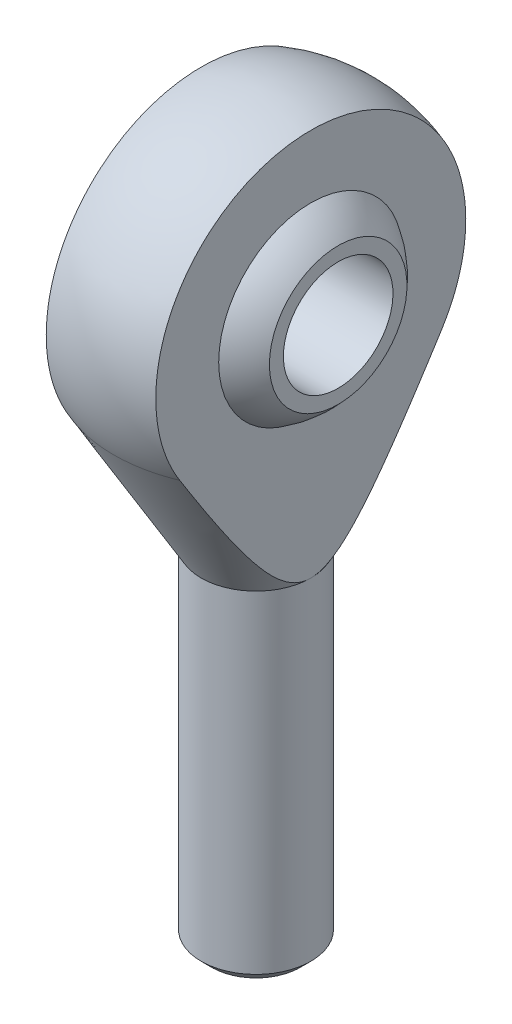
ISO-10303-21;
HEADER;
FILE_DESCRIPTION(('STEP AP214'),'2;1');
FILE_NAME('part.step','',(''),(''),'','','');
FILE_SCHEMA(('AUTOMOTIVE_DESIGN { 1 0 10303 214 1 1 1 1 }'));
ENDSEC;
DATA;
#1=APPLICATION_CONTEXT('core data for automotive mechanical design processes');
#2=APPLICATION_PROTOCOL_DEFINITION('international standard','automotive_design',2000,#1);
#3=PRODUCT_CONTEXT('',#1,'mechanical');
#4=PRODUCT('Part','Part','',(#3));
#5=PRODUCT_RELATED_PRODUCT_CATEGORY('part','',(#4));
#6=PRODUCT_DEFINITION_FORMATION('','',#4);
#7=PRODUCT_DEFINITION_CONTEXT('part definition',#1,'design');
#8=PRODUCT_DEFINITION('design','',#6,#7);
#9=PRODUCT_DEFINITION_SHAPE('','',#8);
#10=(LENGTH_UNIT() NAMED_UNIT(*) SI_UNIT(.MILLI.,.METRE.));
#11=(NAMED_UNIT(*) PLANE_ANGLE_UNIT() SI_UNIT($,.RADIAN.));
#12=(NAMED_UNIT(*) SI_UNIT($,.STERADIAN.) SOLID_ANGLE_UNIT());
#13=UNCERTAINTY_MEASURE_WITH_UNIT(LENGTH_MEASURE(1.E-05),#10,'distance_accuracy_value','');
#14=(GEOMETRIC_REPRESENTATION_CONTEXT(3) GLOBAL_UNCERTAINTY_ASSIGNED_CONTEXT((#13)) GLOBAL_UNIT_ASSIGNED_CONTEXT((#10,
#11,#12)) REPRESENTATION_CONTEXT('',''));
#15=CARTESIAN_POINT('',(0.,0.,0.));
#16=DIRECTION('',(0.,0.,1.));
#17=DIRECTION('',(1.,0.,0.));
#18=AXIS2_PLACEMENT_3D('',#15,#16,#17);
#19=CARTESIAN_POINT('',(0.,-11.5146693082925,0.));
#20=DIRECTION('',(0.,1.,0.));
#21=DIRECTION('',(-1.,0.,0.));
#22=AXIS2_PLACEMENT_3D('',#19,#20,#21);
#23=CONICAL_SURFACE('',#22,7.187655439757,0.526424193542879);
#24=CARTESIAN_POINT('',(4.,-17.,0.));
#25=CARTESIAN_POINT('',(4.,-17.,2.66380268389854));
#26=CARTESIAN_POINT('',(4.,-6.029338616585,9.57324792568132));
#27=(BOUNDED_CURVE() B_SPLINE_CURVE(2,(#24,#25,#26),.UNSPECIFIED.,.F.,
.F.) B_SPLINE_CURVE_WITH_KNOTS((3,3),(1.47809575436981,2.95619150873963),
.UNSPECIFIED.) CURVE() GEOMETRIC_REPRESENTATION_ITEM() RATIONAL_B_SPLINE_CURVE((1.,
1.34049015659916,1.)) REPRESENTATION_ITEM(''));
#28=CARTESIAN_POINT('',(4.,-17.,0.));
#29=VERTEX_POINT('',#28);
#30=CARTESIAN_POINT('',(4.,-6.029338616585,9.57324792568131));
#31=VERTEX_POINT('',#30);
#32=EDGE_CURVE('E107',#29,#31,#27,.T.);
#33=ORIENTED_EDGE('',*,*,#32,.T.);
#34=CARTESIAN_POINT('',(0.,-6.029338616585,0.));
#35=DIRECTION('',(0.,1.,0.));
#36=DIRECTION('',(1.,0.,0.));
#37=AXIS2_PLACEMENT_3D('',#34,#35,#36);
#38=CIRCLE('',#37,10.375310879514);
#39=CARTESIAN_POINT('',(-4.,-6.029338616585,9.57324792568131));
#40=VERTEX_POINT('',#39);
#41=EDGE_CURVE('E25',#40,#31,#38,.T.);
#42=ORIENTED_EDGE('',*,*,#41,.F.);
#43=CARTESIAN_POINT('',(-4.,-6.029338616585,9.57324792568132));
#44=CARTESIAN_POINT('',(-4.,-17.,2.66380268389854));
#45=CARTESIAN_POINT('',(-4.,-17.,0.));
#46=(BOUNDED_CURVE() B_SPLINE_CURVE(2,(#43,#44,#45),.UNSPECIFIED.,.F.,
.F.) B_SPLINE_CURVE_WITH_KNOTS((3,3),(0.,1.47809575436981),
.UNSPECIFIED.) CURVE() GEOMETRIC_REPRESENTATION_ITEM() RATIONAL_B_SPLINE_CURVE((1.,
1.34049015659916,1.)) REPRESENTATION_ITEM(''));
#47=CARTESIAN_POINT('',(-4.,-17.,0.));
#48=VERTEX_POINT('',#47);
#49=EDGE_CURVE('E10',#40,#48,#46,.T.);
#50=ORIENTED_EDGE('',*,*,#49,.T.);
#51=CARTESIAN_POINT('',(0.,-17.,0.));
#52=DIRECTION('',(0.,1.,0.));
#53=DIRECTION('',(1.,0.,0.));
#54=AXIS2_PLACEMENT_3D('',#51,#52,#53);
#55=CIRCLE('',#54,4.);
#56=EDGE_CURVE('E78',#48,#29,#55,.T.);
#57=ORIENTED_EDGE('',*,*,#56,.T.);
#58=EDGE_LOOP('',(#33,#42,#50,#57));
#59=FACE_BOUND('',#58,.T.);
#60=ADVANCED_FACE('F16',(#59),#23,.T.);
#61=CARTESIAN_POINT('',(-4.,-17.,0.));
#62=DIRECTION('',(1.,0.,0.));
#63=DIRECTION('',(0.,1.,0.));
#64=AXIS2_PLACEMENT_3D('',#61,#62,#63);
#65=PLANE('',#64);
#66=CARTESIAN_POINT('',(-4.,-17.,0.));
#67=CARTESIAN_POINT('',(-4.,-17.,-2.66380268389854));
#68=CARTESIAN_POINT('',(-4.,-6.029338616585,-9.57324792568132));
#69=(BOUNDED_CURVE() B_SPLINE_CURVE(2,(#66,#67,#68),.UNSPECIFIED.,.F.,
.F.) B_SPLINE_CURVE_WITH_KNOTS((3,3),(1.47809575436981,2.95619150873963),
.UNSPECIFIED.) CURVE() GEOMETRIC_REPRESENTATION_ITEM() RATIONAL_B_SPLINE_CURVE((1.,
1.34049015659916,1.)) REPRESENTATION_ITEM(''));
#70=CARTESIAN_POINT('',(-4.,-6.029338616585,-9.57324792568131));
#71=VERTEX_POINT('',#70);
#72=EDGE_CURVE('E91',#48,#71,#69,.T.);
#73=ORIENTED_EDGE('',*,*,#72,.F.);
#74=ORIENTED_EDGE('',*,*,#49,.F.);
#75=CARTESIAN_POINT('',(-4.,1.93178806284777E-13,0.));
#76=DIRECTION('',(1.,0.,0.));
#77=DIRECTION('',(0.,0.,1.));
#78=AXIS2_PLACEMENT_3D('',#75,#76,#77);
#79=CIRCLE('',#78,11.3137084989853);
#80=EDGE_CURVE('E87',#71,#40,#79,.T.);
#81=ORIENTED_EDGE('',*,*,#80,.F.);
#82=EDGE_LOOP('',(#73,#74,#81));
#83=FACE_BOUND('',#82,.T.);
#84=CARTESIAN_POINT('',(-4.,0.,0.));
#85=DIRECTION('',(1.,0.,0.));
#86=DIRECTION('',(0.,0.,-1.));
#87=AXIS2_PLACEMENT_3D('',#84,#85,#86);
#88=CIRCLE('',#87,6.72383818960574);
#89=CARTESIAN_POINT('',(-4.,0.,6.72383818960574));
#90=VERTEX_POINT('',#89);
#91=EDGE_CURVE('E116',#90,#90,#88,.T.);
#92=ORIENTED_EDGE('',*,*,#91,.T.);
#93=EDGE_LOOP('',(#92));
#94=FACE_BOUND('',#93,.T.);
#95=ADVANCED_FACE('F158',(#83,#94),#65,.F.);
#96=CARTESIAN_POINT('',(-5.62883073484954E-13,1.93178806284777E-13,0.));
#97=DIRECTION('',(0.,0.,1.));
#98=DIRECTION('',(1.,0.,0.));
#99=AXIS2_PLACEMENT_3D('',#96,#97,#98);
#100=SPHERICAL_SURFACE('',#99,12.0000000000004);
#101=CARTESIAN_POINT('',(4.,1.93178806284777E-13,0.));
#102=DIRECTION('',(-1.,0.,0.));
#103=DIRECTION('',(0.,0.,-1.));
#104=AXIS2_PLACEMENT_3D('',#101,#102,#103);
#105=CIRCLE('',#104,11.313708498985);
#106=CARTESIAN_POINT('',(4.,-6.029338616585,-9.57324792568131));
#107=VERTEX_POINT('',#106);
#108=EDGE_CURVE('E112',#31,#107,#105,.T.);
#109=ORIENTED_EDGE('',*,*,#108,.T.);
#110=CARTESIAN_POINT('',(0.,-6.029338616585,0.));
#111=DIRECTION('',(0.,1.,0.));
#112=DIRECTION('',(1.,0.,0.));
#113=AXIS2_PLACEMENT_3D('',#110,#111,#112);
#114=CIRCLE('',#113,10.375310879514);
#115=EDGE_CURVE('E90',#107,#71,#114,.T.);
#116=ORIENTED_EDGE('',*,*,#115,.T.);
#117=ORIENTED_EDGE('',*,*,#80,.T.);
#118=ORIENTED_EDGE('',*,*,#41,.T.);
#119=EDGE_LOOP('',(#109,#116,#117,#118));
#120=FACE_BOUND('',#119,.T.);
#121=ADVANCED_FACE('F164',(#120),#100,.T.);
#122=CARTESIAN_POINT('',(0.,-11.5146693082925,0.));
#123=DIRECTION('',(0.,1.,0.));
#124=DIRECTION('',(-1.,0.,0.));
#125=AXIS2_PLACEMENT_3D('',#122,#123,#124);
#126=CONICAL_SURFACE('',#125,7.187655439757,0.526424193542879);
#127=CARTESIAN_POINT('',(4.,-6.029338616585,-9.57324792568132));
#128=CARTESIAN_POINT('',(4.,-17.,-2.66380268389854));
#129=CARTESIAN_POINT('',(4.,-17.,0.));
#130=(BOUNDED_CURVE() B_SPLINE_CURVE(2,(#127,#128,#129),.UNSPECIFIED.,.F.,
.F.) B_SPLINE_CURVE_WITH_KNOTS((3,3),(0.,1.47809575436981),
.UNSPECIFIED.) CURVE() GEOMETRIC_REPRESENTATION_ITEM() RATIONAL_B_SPLINE_CURVE((1.,
1.34049015659916,1.)) REPRESENTATION_ITEM(''));
#131=EDGE_CURVE('E95',#107,#29,#130,.T.);
#132=ORIENTED_EDGE('',*,*,#131,.T.);
#133=CARTESIAN_POINT('',(0.,-17.,0.));
#134=DIRECTION('',(0.,1.,0.));
#135=DIRECTION('',(1.,0.,0.));
#136=AXIS2_PLACEMENT_3D('',#133,#134,#135);
#137=CIRCLE('',#136,4.);
#138=EDGE_CURVE('E73',#29,#48,#137,.T.);
#139=ORIENTED_EDGE('',*,*,#138,.T.);
#140=ORIENTED_EDGE('',*,*,#72,.T.);
#141=ORIENTED_EDGE('',*,*,#115,.F.);
#142=EDGE_LOOP('',(#132,#139,#140,#141));
#143=FACE_BOUND('',#142,.T.);
#144=ADVANCED_FACE('F177',(#143),#126,.T.);
#145=CARTESIAN_POINT('',(4.,11.313708498985,0.));
#146=DIRECTION('',(-1.,0.,0.));
#147=DIRECTION('',(0.,-1.,0.));
#148=AXIS2_PLACEMENT_3D('',#145,#146,#147);
#149=PLANE('',#148);
#150=ORIENTED_EDGE('',*,*,#108,.F.);
#151=ORIENTED_EDGE('',*,*,#32,.F.);
#152=ORIENTED_EDGE('',*,*,#131,.F.);
#153=EDGE_LOOP('',(#150,#151,#152));
#154=FACE_BOUND('',#153,.T.);
#155=CARTESIAN_POINT('',(4.,0.,0.));
#156=DIRECTION('',(-1.,0.,0.));
#157=DIRECTION('',(0.,0.,1.));
#158=AXIS2_PLACEMENT_3D('',#155,#156,#157);
#159=CIRCLE('',#158,6.72383818960574);
#160=CARTESIAN_POINT('',(4.,0.,-6.72383818960574));
#161=VERTEX_POINT('',#160);
#162=EDGE_CURVE('E114',#161,#161,#159,.T.);
#163=ORIENTED_EDGE('',*,*,#162,.T.);
#164=EDGE_LOOP('',(#163));
#165=FACE_BOUND('',#164,.T.);
#166=ADVANCED_FACE('F173',(#154,#165),#149,.F.);
#167=CARTESIAN_POINT('',(0.,0.,0.));
#168=DIRECTION('',(0.,0.,1.));
#169=DIRECTION('',(1.,0.,0.));
#170=AXIS2_PLACEMENT_3D('',#167,#168,#169);
#171=SPHERICAL_SURFACE('',#170,7.8236819976275);
#172=CARTESIAN_POINT('',(0.,0.,0.));
#173=DIRECTION('',(-1.,0.,0.));
#174=DIRECTION('',(0.,0.,1.));
#175=AXIS2_PLACEMENT_3D('',#172,#173,#174);
#176=SPHERICAL_SURFACE('',#175,7.8236819976275);
#177=ORIENTED_EDGE('',*,*,#162,.F.);
#178=EDGE_LOOP('',(#177));
#179=FACE_BOUND('',#178,.T.);
#180=CARTESIAN_POINT('',(6.,0.,0.));
#181=DIRECTION('',(-1.,0.,0.));
#182=DIRECTION('',(0.,0.,-1.));
#183=AXIS2_PLACEMENT_3D('',#180,#181,#182);
#184=CIRCLE('',#183,5.02095608425334);
#185=CARTESIAN_POINT('',(6.,0.,5.02095608425334));
#186=VERTEX_POINT('',#185);
#187=EDGE_CURVE('E19',#186,#186,#184,.T.);
#188=ORIENTED_EDGE('',*,*,#187,.T.);
#189=EDGE_LOOP('',(#188));
#190=FACE_BOUND('',#189,.T.);
#191=ADVANCED_FACE('F67',(#179,#190),#176,.T.);
#192=CARTESIAN_POINT('',(0.,0.,0.));
#193=DIRECTION('',(0.,0.,1.));
#194=DIRECTION('',(1.,0.,0.));
#195=AXIS2_PLACEMENT_3D('',#192,#193,#194);
#196=SPHERICAL_SURFACE('',#195,7.8236819976275);
#197=CARTESIAN_POINT('',(0.,0.,0.));
#198=DIRECTION('',(1.,0.,0.));
#199=DIRECTION('',(0.,0.,-1.));
#200=AXIS2_PLACEMENT_3D('',#197,#198,#199);
#201=SPHERICAL_SURFACE('',#200,7.8236819976275);
#202=ORIENTED_EDGE('',*,*,#91,.F.);
#203=EDGE_LOOP('',(#202));
#204=FACE_BOUND('',#203,.T.);
#205=CARTESIAN_POINT('',(-6.,0.,0.));
#206=DIRECTION('',(1.,0.,0.));
#207=DIRECTION('',(0.,0.,1.));
#208=AXIS2_PLACEMENT_3D('',#205,#206,#207);
#209=CIRCLE('',#208,5.02095608425334);
#210=CARTESIAN_POINT('',(-6.,0.,-5.02095608425334));
#211=VERTEX_POINT('',#210);
#212=EDGE_CURVE('E71',#211,#211,#209,.T.);
#213=ORIENTED_EDGE('',*,*,#212,.T.);
#214=EDGE_LOOP('',(#213));
#215=FACE_BOUND('',#214,.T.);
#216=ADVANCED_FACE('F192',(#204,#215),#201,.T.);
#217=CARTESIAN_POINT('',(0.,0.,0.));
#218=DIRECTION('',(-1.,0.,0.));
#219=DIRECTION('',(0.,-1.,0.));
#220=AXIS2_PLACEMENT_3D('',#217,#218,#219);
#221=CYLINDRICAL_SURFACE('',#220,4.);
#222=CARTESIAN_POINT('',(-6.,0.,0.));
#223=DIRECTION('',(-1.,0.,0.));
#224=DIRECTION('',(0.,-1.,0.));
#225=AXIS2_PLACEMENT_3D('',#222,#223,#224);
#226=CIRCLE('',#225,4.);
#227=CARTESIAN_POINT('',(-6.,4.,0.));
#228=VERTEX_POINT('',#227);
#229=EDGE_CURVE('E69',#228,#228,#226,.T.);
#230=ORIENTED_EDGE('',*,*,#229,.T.);
#231=EDGE_LOOP('',(#230));
#232=FACE_BOUND('',#231,.T.);
#233=CARTESIAN_POINT('',(6.,0.,0.));
#234=DIRECTION('',(1.,0.,0.));
#235=DIRECTION('',(0.,-1.,0.));
#236=AXIS2_PLACEMENT_3D('',#233,#234,#235);
#237=CIRCLE('',#236,4.);
#238=CARTESIAN_POINT('',(6.,4.,0.));
#239=VERTEX_POINT('',#238);
#240=EDGE_CURVE('E70',#239,#239,#237,.T.);
#241=ORIENTED_EDGE('',*,*,#240,.T.);
#242=EDGE_LOOP('',(#241));
#243=FACE_BOUND('',#242,.T.);
#244=ADVANCED_FACE('F194',(#232,#243),#221,.F.);
#245=CARTESIAN_POINT('',(-6.,42.,24.));
#246=DIRECTION('',(-1.,0.,0.));
#247=DIRECTION('',(0.,0.,-1.));
#248=AXIS2_PLACEMENT_3D('',#245,#246,#247);
#249=PLANE('',#248);
#250=ORIENTED_EDGE('',*,*,#212,.F.);
#251=EDGE_LOOP('',(#250));
#252=FACE_BOUND('',#251,.T.);
#253=ORIENTED_EDGE('',*,*,#229,.F.);
#254=EDGE_LOOP('',(#253));
#255=FACE_BOUND('',#254,.T.);
#256=ADVANCED_FACE('F201',(#252,#255),#249,.T.);
#257=CARTESIAN_POINT('',(6.,42.,-24.));
#258=DIRECTION('',(1.,0.,0.));
#259=DIRECTION('',(0.,0.,1.));
#260=AXIS2_PLACEMENT_3D('',#257,#258,#259);
#261=PLANE('',#260);
#262=ORIENTED_EDGE('',*,*,#187,.F.);
#263=EDGE_LOOP('',(#262));
#264=FACE_BOUND('',#263,.T.);
#265=ORIENTED_EDGE('',*,*,#240,.F.);
#266=EDGE_LOOP('',(#265));
#267=FACE_BOUND('',#266,.T.);
#268=ADVANCED_FACE('F190',(#264,#267),#261,.T.);
#269=CARTESIAN_POINT('',(-3.233,-42.,0.));
#270=DIRECTION('',(0.,-1.,0.));
#271=DIRECTION('',(0.,0.,-1.));
#272=AXIS2_PLACEMENT_3D('',#269,#270,#271);
#273=PLANE('',#272);
#274=CARTESIAN_POINT('',(0.,-42.,0.));
#275=DIRECTION('',(0.,1.,0.));
#276=DIRECTION('',(1.,0.,0.));
#277=AXIS2_PLACEMENT_3D('',#274,#275,#276);
#278=CIRCLE('',#277,3.233);
#279=CARTESIAN_POINT('',(-3.233,-42.,0.));
#280=VERTEX_POINT('',#279);
#281=EDGE_CURVE('E83',#280,#280,#278,.T.);
#282=ORIENTED_EDGE('',*,*,#281,.F.);
#283=EDGE_LOOP('',(#282));
#284=FACE_BOUND('',#283,.T.);
#285=ADVANCED_FACE('F153',(#284),#273,.T.);
#286=CARTESIAN_POINT('',(0.,-29.1165,0.));
#287=DIRECTION('',(0.,-1.,0.));
#288=DIRECTION('',(-1.,0.,0.));
#289=AXIS2_PLACEMENT_3D('',#286,#287,#288);
#290=CYLINDRICAL_SURFACE('',#289,4.);
#291=CARTESIAN_POINT('',(0.,-41.233,0.));
#292=DIRECTION('',(0.,1.,0.));
#293=DIRECTION('',(1.,0.,0.));
#294=AXIS2_PLACEMENT_3D('',#291,#292,#293);
#295=CIRCLE('',#294,4.);
#296=CARTESIAN_POINT('',(-4.,-41.233,0.));
#297=VERTEX_POINT('',#296);
#298=EDGE_CURVE('E86',#297,#297,#295,.T.);
#299=ORIENTED_EDGE('',*,*,#298,.T.);
#300=EDGE_LOOP('',(#299));
#301=FACE_BOUND('',#300,.T.);
#302=ORIENTED_EDGE('',*,*,#56,.F.);
#303=ORIENTED_EDGE('',*,*,#138,.F.);
#304=EDGE_LOOP('',(#302,#303));
#305=FACE_BOUND('',#304,.T.);
#306=ADVANCED_FACE('F141',(#301,#305),#290,.T.);
#307=CARTESIAN_POINT('',(0.,-41.6165,0.));
#308=DIRECTION('',(0.,1.,0.));
#309=DIRECTION('',(-1.,0.,0.));
#310=AXIS2_PLACEMENT_3D('',#307,#308,#309);
#311=CONICAL_SURFACE('',#310,3.6165,0.785398163397444);
#312=ORIENTED_EDGE('',*,*,#281,.T.);
#313=EDGE_LOOP('',(#312));
#314=FACE_BOUND('',#313,.T.);
#315=ORIENTED_EDGE('',*,*,#298,.F.);
#316=EDGE_LOOP('',(#315));
#317=FACE_BOUND('',#316,.T.);
#318=ADVANCED_FACE('F144',(#314,#317),#311,.T.);
#319=CLOSED_SHELL('',(#60,#95,#121,#144,#166,#191,#216,#244,#256,#268,#285,#306,#318));
#320=MANIFOLD_SOLID_BREP('B1',#319);
#321=ADVANCED_BREP_SHAPE_REPRESENTATION('',(#18,#320),#14);
#322=SHAPE_DEFINITION_REPRESENTATION(#9,#321);
ENDSEC;
END-ISO-10303-21;
